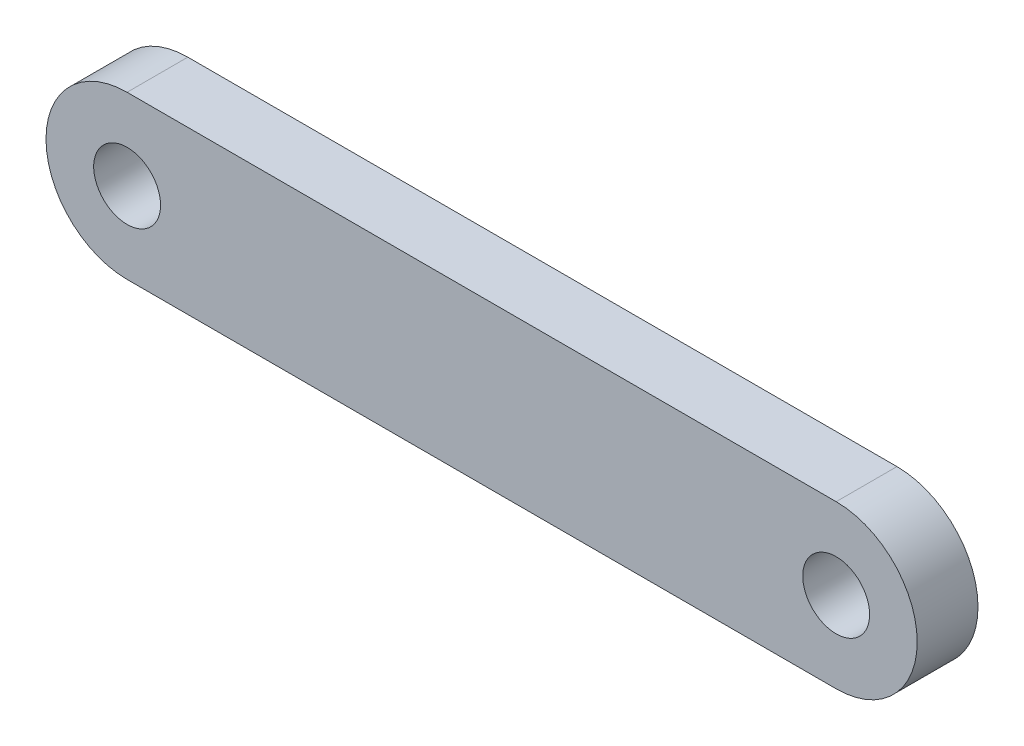
ISO-10303-21;
HEADER;
FILE_DESCRIPTION(('STEP AP214'),'2;1');
FILE_NAME('part.step','',(''),(''),'','','');
FILE_SCHEMA(('AUTOMOTIVE_DESIGN { 1 0 10303 214 1 1 1 1 }'));
ENDSEC;
DATA;
#1=APPLICATION_CONTEXT('core data for automotive mechanical design processes');
#2=APPLICATION_PROTOCOL_DEFINITION('international standard','automotive_design',2000,#1);
#3=PRODUCT_CONTEXT('',#1,'mechanical');
#4=PRODUCT('Part','Part','',(#3));
#5=PRODUCT_RELATED_PRODUCT_CATEGORY('part','',(#4));
#6=PRODUCT_DEFINITION_FORMATION('','',#4);
#7=PRODUCT_DEFINITION_CONTEXT('part definition',#1,'design');
#8=PRODUCT_DEFINITION('design','',#6,#7);
#9=PRODUCT_DEFINITION_SHAPE('','',#8);
#10=(LENGTH_UNIT() NAMED_UNIT(*) SI_UNIT(.MILLI.,.METRE.));
#11=(NAMED_UNIT(*) PLANE_ANGLE_UNIT() SI_UNIT($,.RADIAN.));
#12=(NAMED_UNIT(*) SI_UNIT($,.STERADIAN.) SOLID_ANGLE_UNIT());
#13=UNCERTAINTY_MEASURE_WITH_UNIT(LENGTH_MEASURE(1.E-05),#10,'distance_accuracy_value','');
#14=(GEOMETRIC_REPRESENTATION_CONTEXT(3) GLOBAL_UNCERTAINTY_ASSIGNED_CONTEXT((#13)) GLOBAL_UNIT_ASSIGNED_CONTEXT((#10,
#11,#12)) REPRESENTATION_CONTEXT('',''));
#15=CARTESIAN_POINT('',(0.,0.,0.));
#16=DIRECTION('',(0.,0.,1.));
#17=DIRECTION('',(1.,0.,0.));
#18=AXIS2_PLACEMENT_3D('',#15,#16,#17);
#19=CARTESIAN_POINT('',(8.91356806162641,-42.8601943949345,3.));
#20=DIRECTION('',(0.,0.,1.));
#21=DIRECTION('',(1.,0.,0.));
#22=AXIS2_PLACEMENT_3D('',#19,#20,#21);
#23=PLANE('',#22);
#24=CARTESIAN_POINT('',(43.9135680616264,-42.8601943949345,3.));
#25=DIRECTION('',(0.,0.,1.));
#26=DIRECTION('',(1.,0.,0.));
#27=AXIS2_PLACEMENT_3D('',#24,#25,#26);
#28=CIRCLE('',#27,1.65);
#29=CARTESIAN_POINT('',(45.5635680616264,-42.8601943949345,3.));
#30=VERTEX_POINT('',#29);
#31=EDGE_CURVE('E101',#30,#30,#28,.T.);
#32=ORIENTED_EDGE('',*,*,#31,.F.);
#33=EDGE_LOOP('',(#32));
#34=FACE_BOUND('',#33,.T.);
#35=CARTESIAN_POINT('',(8.91356806162641,-42.8601943949345,3.));
#36=DIRECTION('',(0.,0.,1.));
#37=DIRECTION('',(1.,0.,0.));
#38=AXIS2_PLACEMENT_3D('',#35,#36,#37);
#39=CIRCLE('',#38,3.99999999999999);
#40=CARTESIAN_POINT('',(8.91356806162641,-38.8601943949345,3.));
#41=VERTEX_POINT('',#40);
#42=CARTESIAN_POINT('',(8.91356806162641,-46.8601943949345,3.));
#43=VERTEX_POINT('',#42);
#44=EDGE_CURVE('E86',#41,#43,#39,.T.);
#45=ORIENTED_EDGE('',*,*,#44,.T.);
#46=DIRECTION('',(1.,0.,0.));
#47=VECTOR('',#46,1.);
#48=CARTESIAN_POINT('',(8.91356806162641,-46.8601943949345,3.));
#49=LINE('',#48,#47);
#50=CARTESIAN_POINT('',(43.9135680616264,-46.8601943949345,3.));
#51=VERTEX_POINT('',#50);
#52=EDGE_CURVE('E81',#43,#51,#49,.T.);
#53=ORIENTED_EDGE('',*,*,#52,.T.);
#54=CARTESIAN_POINT('',(43.9135680616264,-42.8601943949345,3.));
#55=DIRECTION('',(0.,0.,1.));
#56=DIRECTION('',(1.,0.,0.));
#57=AXIS2_PLACEMENT_3D('',#54,#55,#56);
#58=CIRCLE('',#57,4.);
#59=CARTESIAN_POINT('',(43.9135680616264,-38.8601943949345,3.));
#60=VERTEX_POINT('',#59);
#61=EDGE_CURVE('E84',#51,#60,#58,.T.);
#62=ORIENTED_EDGE('',*,*,#61,.T.);
#63=DIRECTION('',(-1.,0.,0.));
#64=VECTOR('',#63,1.);
#65=CARTESIAN_POINT('',(8.91356806162641,-38.8601943949345,3.));
#66=LINE('',#65,#64);
#67=EDGE_CURVE('E51',#60,#41,#66,.T.);
#68=ORIENTED_EDGE('',*,*,#67,.T.);
#69=EDGE_LOOP('',(#45,#53,#62,#68));
#70=FACE_BOUND('',#69,.T.);
#71=CARTESIAN_POINT('',(8.91674439207498,-42.8601943949344,3.));
#72=DIRECTION('',(0.,0.,1.));
#73=DIRECTION('',(1.,0.,0.));
#74=AXIS2_PLACEMENT_3D('',#71,#72,#73);
#75=CIRCLE('',#74,1.65);
#76=CARTESIAN_POINT('',(10.566744392075,-42.8601943949344,3.));
#77=VERTEX_POINT('',#76);
#78=EDGE_CURVE('E116',#77,#77,#75,.T.);
#79=ORIENTED_EDGE('',*,*,#78,.F.);
#80=EDGE_LOOP('',(#79));
#81=FACE_BOUND('',#80,.T.);
#82=ADVANCED_FACE('F34',(#34,#70,#81),#23,.T.);
#83=CARTESIAN_POINT('',(8.91356806162641,-42.8601943949345,0.));
#84=DIRECTION('',(0.,0.,1.));
#85=DIRECTION('',(1.,0.,0.));
#86=AXIS2_PLACEMENT_3D('',#83,#84,#85);
#87=PLANE('',#86);
#88=CARTESIAN_POINT('',(8.91356806162641,-42.8601943949345,0.));
#89=DIRECTION('',(0.,0.,1.));
#90=DIRECTION('',(1.,0.,0.));
#91=AXIS2_PLACEMENT_3D('',#88,#89,#90);
#92=CIRCLE('',#91,3.99999999999999);
#93=CARTESIAN_POINT('',(8.91356806162641,-38.8601943949345,0.));
#94=VERTEX_POINT('',#93);
#95=CARTESIAN_POINT('',(8.91356806162641,-46.8601943949345,0.));
#96=VERTEX_POINT('',#95);
#97=EDGE_CURVE('E98',#94,#96,#92,.T.);
#98=ORIENTED_EDGE('',*,*,#97,.F.);
#99=DIRECTION('',(-1.,0.,0.));
#100=VECTOR('',#99,1.);
#101=CARTESIAN_POINT('',(8.91356806162641,-38.8601943949345,0.));
#102=LINE('',#101,#100);
#103=CARTESIAN_POINT('',(43.9135680616264,-38.8601943949345,0.));
#104=VERTEX_POINT('',#103);
#105=EDGE_CURVE('E74',#104,#94,#102,.T.);
#106=ORIENTED_EDGE('',*,*,#105,.F.);
#107=CARTESIAN_POINT('',(43.9135680616264,-42.8601943949345,0.));
#108=DIRECTION('',(0.,0.,1.));
#109=DIRECTION('',(1.,0.,0.));
#110=AXIS2_PLACEMENT_3D('',#107,#108,#109);
#111=CIRCLE('',#110,4.);
#112=CARTESIAN_POINT('',(43.9135680616264,-46.8601943949345,0.));
#113=VERTEX_POINT('',#112);
#114=EDGE_CURVE('E68',#113,#104,#111,.T.);
#115=ORIENTED_EDGE('',*,*,#114,.F.);
#116=DIRECTION('',(1.,0.,0.));
#117=VECTOR('',#116,1.);
#118=CARTESIAN_POINT('',(8.91356806162641,-46.8601943949345,0.));
#119=LINE('',#118,#117);
#120=EDGE_CURVE('E90',#96,#113,#119,.T.);
#121=ORIENTED_EDGE('',*,*,#120,.F.);
#122=EDGE_LOOP('',(#98,#106,#115,#121));
#123=FACE_BOUND('',#122,.T.);
#124=CARTESIAN_POINT('',(43.9135680616264,-42.8601943949345,0.));
#125=DIRECTION('',(0.,0.,1.));
#126=DIRECTION('',(1.,0.,0.));
#127=AXIS2_PLACEMENT_3D('',#124,#125,#126);
#128=CIRCLE('',#127,1.65);
#129=CARTESIAN_POINT('',(45.5635680616264,-42.8601943949345,0.));
#130=VERTEX_POINT('',#129);
#131=EDGE_CURVE('E113',#130,#130,#128,.T.);
#132=ORIENTED_EDGE('',*,*,#131,.T.);
#133=EDGE_LOOP('',(#132));
#134=FACE_BOUND('',#133,.T.);
#135=CARTESIAN_POINT('',(8.91674439207498,-42.8601943949344,0.));
#136=DIRECTION('',(0.,0.,1.));
#137=DIRECTION('',(1.,0.,0.));
#138=AXIS2_PLACEMENT_3D('',#135,#136,#137);
#139=CIRCLE('',#138,1.65);
#140=CARTESIAN_POINT('',(10.566744392075,-42.8601943949344,0.));
#141=VERTEX_POINT('',#140);
#142=EDGE_CURVE('E119',#141,#141,#139,.T.);
#143=ORIENTED_EDGE('',*,*,#142,.T.);
#144=EDGE_LOOP('',(#143));
#145=FACE_BOUND('',#144,.T.);
#146=ADVANCED_FACE('F109',(#123,#134,#145),#87,.F.);
#147=CARTESIAN_POINT('',(8.91356806162641,-42.8601943949345,3.));
#148=DIRECTION('',(0.,0.,-1.));
#149=DIRECTION('',(-1.,0.,0.));
#150=AXIS2_PLACEMENT_3D('',#147,#148,#149);
#151=CYLINDRICAL_SURFACE('',#150,3.99999999999999);
#152=ORIENTED_EDGE('',*,*,#97,.T.);
#153=DIRECTION('',(0.,0.,-1.));
#154=VECTOR('',#153,1.);
#155=CARTESIAN_POINT('',(8.91356806162641,-46.8601943949345,3.));
#156=LINE('',#155,#154);
#157=EDGE_CURVE('E11',#43,#96,#156,.T.);
#158=ORIENTED_EDGE('',*,*,#157,.F.);
#159=ORIENTED_EDGE('',*,*,#44,.F.);
#160=DIRECTION('',(0.,0.,-1.));
#161=VECTOR('',#160,1.);
#162=CARTESIAN_POINT('',(8.91356806162641,-38.8601943949345,3.));
#163=LINE('',#162,#161);
#164=EDGE_CURVE('E94',#41,#94,#163,.T.);
#165=ORIENTED_EDGE('',*,*,#164,.T.);
#166=EDGE_LOOP('',(#152,#158,#159,#165));
#167=FACE_BOUND('',#166,.T.);
#168=ADVANCED_FACE('F36',(#167),#151,.T.);
#169=CARTESIAN_POINT('',(8.91356806162641,-46.8601943949345,3.));
#170=DIRECTION('',(0.,1.,0.));
#171=DIRECTION('',(-1.,0.,0.));
#172=AXIS2_PLACEMENT_3D('',#169,#170,#171);
#173=PLANE('',#172);
#174=ORIENTED_EDGE('',*,*,#120,.T.);
#175=DIRECTION('',(0.,0.,-1.));
#176=VECTOR('',#175,1.);
#177=CARTESIAN_POINT('',(43.9135680616264,-46.8601943949345,3.));
#178=LINE('',#177,#176);
#179=EDGE_CURVE('E43',#51,#113,#178,.T.);
#180=ORIENTED_EDGE('',*,*,#179,.F.);
#181=ORIENTED_EDGE('',*,*,#52,.F.);
#182=ORIENTED_EDGE('',*,*,#157,.T.);
#183=EDGE_LOOP('',(#174,#180,#181,#182));
#184=FACE_BOUND('',#183,.T.);
#185=ADVANCED_FACE('F89',(#184),#173,.F.);
#186=CARTESIAN_POINT('',(43.9135680616264,-42.8601943949345,3.));
#187=DIRECTION('',(0.,0.,-1.));
#188=DIRECTION('',(-1.,0.,0.));
#189=AXIS2_PLACEMENT_3D('',#186,#187,#188);
#190=CYLINDRICAL_SURFACE('',#189,4.);
#191=ORIENTED_EDGE('',*,*,#114,.T.);
#192=DIRECTION('',(0.,0.,-1.));
#193=VECTOR('',#192,1.);
#194=CARTESIAN_POINT('',(43.9135680616264,-38.8601943949345,3.));
#195=LINE('',#194,#193);
#196=EDGE_CURVE('E91',#60,#104,#195,.T.);
#197=ORIENTED_EDGE('',*,*,#196,.F.);
#198=ORIENTED_EDGE('',*,*,#61,.F.);
#199=ORIENTED_EDGE('',*,*,#179,.T.);
#200=EDGE_LOOP('',(#191,#197,#198,#199));
#201=FACE_BOUND('',#200,.T.);
#202=ADVANCED_FACE('F92',(#201),#190,.T.);
#203=CARTESIAN_POINT('',(8.91356806162641,-38.8601943949345,3.));
#204=DIRECTION('',(0.,-1.,0.));
#205=DIRECTION('',(1.,0.,0.));
#206=AXIS2_PLACEMENT_3D('',#203,#204,#205);
#207=PLANE('',#206);
#208=ORIENTED_EDGE('',*,*,#105,.T.);
#209=ORIENTED_EDGE('',*,*,#164,.F.);
#210=ORIENTED_EDGE('',*,*,#67,.F.);
#211=ORIENTED_EDGE('',*,*,#196,.T.);
#212=EDGE_LOOP('',(#208,#209,#210,#211));
#213=FACE_BOUND('',#212,.T.);
#214=ADVANCED_FACE('F106',(#213),#207,.F.);
#215=CARTESIAN_POINT('',(43.9135680616264,-42.8601943949345,3.));
#216=DIRECTION('',(0.,0.,-1.));
#217=DIRECTION('',(-1.,0.,0.));
#218=AXIS2_PLACEMENT_3D('',#215,#216,#217);
#219=CYLINDRICAL_SURFACE('',#218,1.65);
#220=ORIENTED_EDGE('',*,*,#31,.T.);
#221=EDGE_LOOP('',(#220));
#222=FACE_BOUND('',#221,.T.);
#223=ORIENTED_EDGE('',*,*,#131,.F.);
#224=EDGE_LOOP('',(#223));
#225=FACE_BOUND('',#224,.T.);
#226=ADVANCED_FACE('F136',(#222,#225),#219,.F.);
#227=CARTESIAN_POINT('',(8.91674439207498,-42.8601943949344,3.));
#228=DIRECTION('',(0.,0.,-1.));
#229=DIRECTION('',(-1.,0.,0.));
#230=AXIS2_PLACEMENT_3D('',#227,#228,#229);
#231=CYLINDRICAL_SURFACE('',#230,1.65);
#232=ORIENTED_EDGE('',*,*,#78,.T.);
#233=EDGE_LOOP('',(#232));
#234=FACE_BOUND('',#233,.T.);
#235=ORIENTED_EDGE('',*,*,#142,.F.);
#236=EDGE_LOOP('',(#235));
#237=FACE_BOUND('',#236,.T.);
#238=ADVANCED_FACE('F125',(#234,#237),#231,.F.);
#239=CLOSED_SHELL('',(#82,#146,#168,#185,#202,#214,#226,#238));
#240=MANIFOLD_SOLID_BREP('B2',#239);
#241=ADVANCED_BREP_SHAPE_REPRESENTATION('',(#18,#240),#14);
#242=SHAPE_DEFINITION_REPRESENTATION(#9,#241);
ENDSEC;
END-ISO-10303-21;
